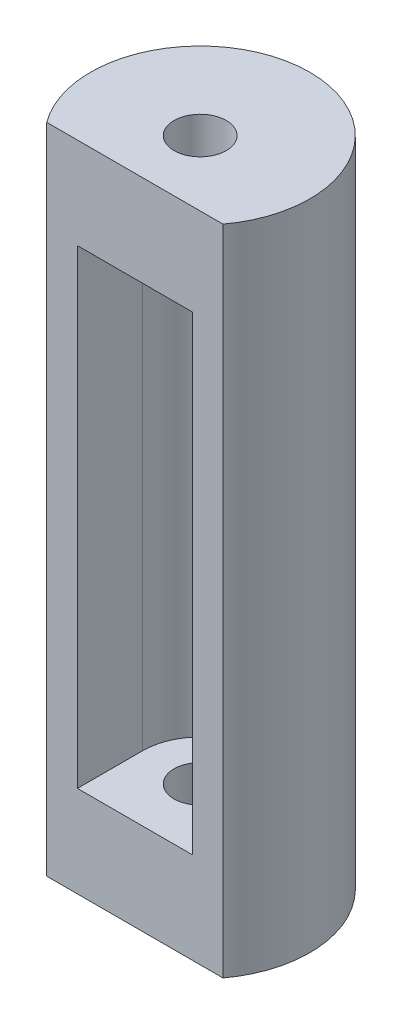
ISO-10303-21;
HEADER;
FILE_DESCRIPTION(('STEP AP214'),'2;1');
FILE_NAME('part.step','',(''),(''),'','','');
FILE_SCHEMA(('AUTOMOTIVE_DESIGN { 1 0 10303 214 1 1 1 1 }'));
ENDSEC;
DATA;
#1=APPLICATION_CONTEXT('core data for automotive mechanical design processes');
#2=APPLICATION_PROTOCOL_DEFINITION('international standard','automotive_design',2000,#1);
#3=PRODUCT_CONTEXT('',#1,'mechanical');
#4=PRODUCT('Part','Part','',(#3));
#5=PRODUCT_RELATED_PRODUCT_CATEGORY('part','',(#4));
#6=PRODUCT_DEFINITION_FORMATION('','',#4);
#7=PRODUCT_DEFINITION_CONTEXT('part definition',#1,'design');
#8=PRODUCT_DEFINITION('design','',#6,#7);
#9=PRODUCT_DEFINITION_SHAPE('','',#8);
#10=(LENGTH_UNIT() NAMED_UNIT(*) SI_UNIT(.MILLI.,.METRE.));
#11=(NAMED_UNIT(*) PLANE_ANGLE_UNIT() SI_UNIT($,.RADIAN.));
#12=(NAMED_UNIT(*) SI_UNIT($,.STERADIAN.) SOLID_ANGLE_UNIT());
#13=UNCERTAINTY_MEASURE_WITH_UNIT(LENGTH_MEASURE(1.E-05),#10,'distance_accuracy_value','');
#14=(GEOMETRIC_REPRESENTATION_CONTEXT(3) GLOBAL_UNCERTAINTY_ASSIGNED_CONTEXT((#13)) GLOBAL_UNIT_ASSIGNED_CONTEXT((#10,
#11,#12)) REPRESENTATION_CONTEXT('',''));
#15=CARTESIAN_POINT('',(0.,0.,0.));
#16=DIRECTION('',(0.,0.,1.));
#17=DIRECTION('',(1.,0.,0.));
#18=AXIS2_PLACEMENT_3D('',#15,#16,#17);
#19=CARTESIAN_POINT('',(0.,7.,0.));
#20=DIRECTION('',(0.,1.,0.));
#21=DIRECTION('',(0.,0.,1.));
#22=AXIS2_PLACEMENT_3D('',#19,#20,#21);
#23=PLANE('',#22);
#24=DIRECTION('',(0.,0.,-1.));
#25=VECTOR('',#24,1.);
#26=CARTESIAN_POINT('',(-4.4,7.,0.));
#27=LINE('',#26,#25);
#28=CARTESIAN_POINT('',(-4.4,7.,5.));
#29=VERTEX_POINT('',#28);
#30=CARTESIAN_POINT('',(-4.4,7.,0.));
#31=VERTEX_POINT('',#30);
#32=EDGE_CURVE('E124',#29,#31,#27,.T.);
#33=ORIENTED_EDGE('',*,*,#32,.F.);
#34=DIRECTION('',(1.,0.,0.));
#35=VECTOR('',#34,1.);
#36=CARTESIAN_POINT('',(6.74981481227448,7.,5.));
#37=LINE('',#36,#35);
#38=CARTESIAN_POINT('',(4.4,7.,5.));
#39=VERTEX_POINT('',#38);
#40=EDGE_CURVE('E161',#29,#39,#37,.T.);
#41=ORIENTED_EDGE('',*,*,#40,.T.);
#42=DIRECTION('',(0.,0.,1.));
#43=VECTOR('',#42,1.);
#44=CARTESIAN_POINT('',(4.4,7.,0.));
#45=LINE('',#44,#43);
#46=CARTESIAN_POINT('',(4.4,7.,0.));
#47=VERTEX_POINT('',#46);
#48=EDGE_CURVE('E60',#47,#39,#45,.T.);
#49=ORIENTED_EDGE('',*,*,#48,.F.);
#50=CARTESIAN_POINT('',(0.,7.,0.));
#51=DIRECTION('',(0.,-1.,0.));
#52=DIRECTION('',(0.,0.,1.));
#53=AXIS2_PLACEMENT_3D('',#50,#51,#52);
#54=CIRCLE('',#53,4.4);
#55=EDGE_CURVE('E55',#31,#47,#54,.T.);
#56=ORIENTED_EDGE('',*,*,#55,.F.);
#57=EDGE_LOOP('',(#33,#41,#49,#56));
#58=FACE_BOUND('',#57,.T.);
#59=CARTESIAN_POINT('',(0.,7.,0.));
#60=DIRECTION('',(0.,1.,0.));
#61=DIRECTION('',(0.,0.,1.));
#62=AXIS2_PLACEMENT_3D('',#59,#60,#61);
#63=CIRCLE('',#62,2.);
#64=CARTESIAN_POINT('',(0.,7.,2.));
#65=VERTEX_POINT('',#64);
#66=EDGE_CURVE('E154',#65,#65,#63,.T.);
#67=ORIENTED_EDGE('',*,*,#66,.F.);
#68=EDGE_LOOP('',(#67));
#69=FACE_BOUND('',#68,.T.);
#70=ADVANCED_FACE('F39',(#58,#69),#23,.T.);
#71=CARTESIAN_POINT('',(0.,0.,0.));
#72=DIRECTION('',(0.,1.,0.));
#73=DIRECTION('',(0.,0.,1.));
#74=AXIS2_PLACEMENT_3D('',#71,#72,#73);
#75=PLANE('',#74);
#76=CARTESIAN_POINT('',(0.,0.,0.));
#77=DIRECTION('',(0.,1.,0.));
#78=DIRECTION('',(0.,0.,1.));
#79=AXIS2_PLACEMENT_3D('',#76,#77,#78);
#80=CIRCLE('',#79,8.4);
#81=CARTESIAN_POINT('',(6.74981481227448,0.,5.));
#82=VERTEX_POINT('',#81);
#83=CARTESIAN_POINT('',(-6.74981481227448,0.,5.));
#84=VERTEX_POINT('',#83);
#85=EDGE_CURVE('E97',#82,#84,#80,.T.);
#86=ORIENTED_EDGE('',*,*,#85,.F.);
#87=DIRECTION('',(1.,0.,0.));
#88=VECTOR('',#87,1.);
#89=CARTESIAN_POINT('',(6.74981481227448,0.,5.));
#90=LINE('',#89,#88);
#91=EDGE_CURVE('E164',#84,#82,#90,.T.);
#92=ORIENTED_EDGE('',*,*,#91,.F.);
#93=EDGE_LOOP('',(#86,#92));
#94=FACE_BOUND('',#93,.T.);
#95=CARTESIAN_POINT('',(0.,0.,0.));
#96=DIRECTION('',(0.,1.,0.));
#97=DIRECTION('',(0.,0.,1.));
#98=AXIS2_PLACEMENT_3D('',#95,#96,#97);
#99=CIRCLE('',#98,2.);
#100=CARTESIAN_POINT('',(0.,0.,2.));
#101=VERTEX_POINT('',#100);
#102=EDGE_CURVE('E153',#101,#101,#99,.T.);
#103=ORIENTED_EDGE('',*,*,#102,.T.);
#104=EDGE_LOOP('',(#103));
#105=FACE_BOUND('',#104,.T.);
#106=ADVANCED_FACE('F170',(#94,#105),#75,.F.);
#107=CARTESIAN_POINT('',(0.,7.,0.));
#108=DIRECTION('',(0.,-1.,0.));
#109=DIRECTION('',(0.,0.,-1.));
#110=AXIS2_PLACEMENT_3D('',#107,#108,#109);
#111=CYLINDRICAL_SURFACE('',#110,8.4);
#112=ORIENTED_EDGE('',*,*,#85,.T.);
#113=DIRECTION('',(0.,-1.,0.));
#114=VECTOR('',#113,1.);
#115=CARTESIAN_POINT('',(-6.74981481227448,7.,5.));
#116=LINE('',#115,#114);
#117=CARTESIAN_POINT('',(-6.74981481227449,50.,4.99999999999999));
#118=VERTEX_POINT('',#117);
#119=EDGE_CURVE('E11',#118,#84,#116,.T.);
#120=ORIENTED_EDGE('',*,*,#119,.F.);
#121=CARTESIAN_POINT('',(0.,50.,0.));
#122=DIRECTION('',(0.,1.,0.));
#123=DIRECTION('',(0.,0.,1.));
#124=AXIS2_PLACEMENT_3D('',#121,#122,#123);
#125=CIRCLE('',#124,8.4);
#126=CARTESIAN_POINT('',(6.74981481227448,50.,5.));
#127=VERTEX_POINT('',#126);
#128=EDGE_CURVE('E95',#127,#118,#125,.T.);
#129=ORIENTED_EDGE('',*,*,#128,.F.);
#130=DIRECTION('',(0.,-1.,0.));
#131=VECTOR('',#130,1.);
#132=CARTESIAN_POINT('',(6.74981481227448,7.,5.));
#133=LINE('',#132,#131);
#134=EDGE_CURVE('E48',#127,#82,#133,.T.);
#135=ORIENTED_EDGE('',*,*,#134,.T.);
#136=EDGE_LOOP('',(#112,#120,#129,#135));
#137=FACE_BOUND('',#136,.T.);
#138=ADVANCED_FACE('F41',(#137),#111,.T.);
#139=CARTESIAN_POINT('',(6.74981481227448,7.,5.));
#140=DIRECTION('',(0.,0.,-1.));
#141=DIRECTION('',(-1.,0.,0.));
#142=AXIS2_PLACEMENT_3D('',#139,#140,#141);
#143=PLANE('',#142);
#144=ORIENTED_EDGE('',*,*,#134,.F.);
#145=DIRECTION('',(1.,0.,0.));
#146=VECTOR('',#145,1.);
#147=CARTESIAN_POINT('',(6.74981481227448,50.,5.));
#148=LINE('',#147,#146);
#149=EDGE_CURVE('E100',#118,#127,#148,.T.);
#150=ORIENTED_EDGE('',*,*,#149,.F.);
#151=ORIENTED_EDGE('',*,*,#119,.T.);
#152=ORIENTED_EDGE('',*,*,#91,.T.);
#153=EDGE_LOOP('',(#144,#150,#151,#152));
#154=FACE_BOUND('',#153,.T.);
#155=DIRECTION('',(1.,0.,0.));
#156=VECTOR('',#155,1.);
#157=CARTESIAN_POINT('',(6.74981481227448,43.,5.));
#158=LINE('',#157,#156);
#159=CARTESIAN_POINT('',(-4.4,43.,5.));
#160=VERTEX_POINT('',#159);
#161=CARTESIAN_POINT('',(4.4,43.,5.));
#162=VERTEX_POINT('',#161);
#163=EDGE_CURVE('E109',#160,#162,#158,.T.);
#164=ORIENTED_EDGE('',*,*,#163,.T.);
#165=DIRECTION('',(0.,-1.,0.));
#166=VECTOR('',#165,1.);
#167=CARTESIAN_POINT('',(4.4,43.,5.));
#168=LINE('',#167,#166);
#169=EDGE_CURVE('E146',#162,#39,#168,.T.);
#170=ORIENTED_EDGE('',*,*,#169,.T.);
#171=ORIENTED_EDGE('',*,*,#40,.F.);
#172=DIRECTION('',(0.,-1.,0.));
#173=VECTOR('',#172,1.);
#174=CARTESIAN_POINT('',(-4.4,43.,5.));
#175=LINE('',#174,#173);
#176=EDGE_CURVE('E142',#160,#29,#175,.T.);
#177=ORIENTED_EDGE('',*,*,#176,.F.);
#178=EDGE_LOOP('',(#164,#170,#171,#177));
#179=FACE_BOUND('',#178,.T.);
#180=ADVANCED_FACE('F101',(#154,#179),#143,.F.);
#181=CARTESIAN_POINT('',(0.,7.,0.));
#182=DIRECTION('',(0.,-1.,0.));
#183=DIRECTION('',(0.,0.,-1.));
#184=AXIS2_PLACEMENT_3D('',#181,#182,#183);
#185=CYLINDRICAL_SURFACE('',#184,2.);
#186=ORIENTED_EDGE('',*,*,#66,.T.);
#187=EDGE_LOOP('',(#186));
#188=FACE_BOUND('',#187,.T.);
#189=ORIENTED_EDGE('',*,*,#102,.F.);
#190=EDGE_LOOP('',(#189));
#191=FACE_BOUND('',#190,.T.);
#192=ADVANCED_FACE('F176',(#188,#191),#185,.F.);
#193=CARTESIAN_POINT('',(0.,43.,0.));
#194=DIRECTION('',(0.,-1.,0.));
#195=DIRECTION('',(0.,0.,-1.));
#196=AXIS2_PLACEMENT_3D('',#193,#194,#195);
#197=CYLINDRICAL_SURFACE('',#196,4.4);
#198=ORIENTED_EDGE('',*,*,#55,.T.);
#199=DIRECTION('',(0.,-1.,0.));
#200=VECTOR('',#199,1.);
#201=CARTESIAN_POINT('',(4.4,43.,0.));
#202=LINE('',#201,#200);
#203=CARTESIAN_POINT('',(4.4,43.,0.));
#204=VERTEX_POINT('',#203);
#205=EDGE_CURVE('E150',#204,#47,#202,.T.);
#206=ORIENTED_EDGE('',*,*,#205,.F.);
#207=CARTESIAN_POINT('',(0.,43.,0.));
#208=DIRECTION('',(0.,-1.,0.));
#209=DIRECTION('',(0.,0.,1.));
#210=AXIS2_PLACEMENT_3D('',#207,#208,#209);
#211=CIRCLE('',#210,4.4);
#212=CARTESIAN_POINT('',(-4.4,43.,0.));
#213=VERTEX_POINT('',#212);
#214=EDGE_CURVE('E119',#213,#204,#211,.T.);
#215=ORIENTED_EDGE('',*,*,#214,.F.);
#216=DIRECTION('',(0.,-1.,0.));
#217=VECTOR('',#216,1.);
#218=CARTESIAN_POINT('',(-4.4,43.,0.));
#219=LINE('',#218,#217);
#220=EDGE_CURVE('E132',#213,#31,#219,.T.);
#221=ORIENTED_EDGE('',*,*,#220,.T.);
#222=EDGE_LOOP('',(#198,#206,#215,#221));
#223=FACE_BOUND('',#222,.T.);
#224=ADVANCED_FACE('F178',(#223),#197,.F.);
#225=CARTESIAN_POINT('',(4.4,43.,0.));
#226=DIRECTION('',(1.,0.,0.));
#227=DIRECTION('',(0.,0.,-1.));
#228=AXIS2_PLACEMENT_3D('',#225,#226,#227);
#229=PLANE('',#228);
#230=ORIENTED_EDGE('',*,*,#48,.T.);
#231=ORIENTED_EDGE('',*,*,#169,.F.);
#232=DIRECTION('',(0.,0.,1.));
#233=VECTOR('',#232,1.);
#234=CARTESIAN_POINT('',(4.4,43.,0.));
#235=LINE('',#234,#233);
#236=EDGE_CURVE('E123',#204,#162,#235,.T.);
#237=ORIENTED_EDGE('',*,*,#236,.F.);
#238=ORIENTED_EDGE('',*,*,#205,.T.);
#239=EDGE_LOOP('',(#230,#231,#237,#238));
#240=FACE_BOUND('',#239,.T.);
#241=ADVANCED_FACE('F185',(#240),#229,.F.);
#242=CARTESIAN_POINT('',(-4.4,43.,0.));
#243=DIRECTION('',(-1.,0.,0.));
#244=DIRECTION('',(0.,0.,1.));
#245=AXIS2_PLACEMENT_3D('',#242,#243,#244);
#246=PLANE('',#245);
#247=ORIENTED_EDGE('',*,*,#32,.T.);
#248=ORIENTED_EDGE('',*,*,#220,.F.);
#249=DIRECTION('',(0.,0.,-1.));
#250=VECTOR('',#249,1.);
#251=CARTESIAN_POINT('',(-4.4,43.,0.));
#252=LINE('',#251,#250);
#253=EDGE_CURVE('E128',#160,#213,#252,.T.);
#254=ORIENTED_EDGE('',*,*,#253,.F.);
#255=ORIENTED_EDGE('',*,*,#176,.T.);
#256=EDGE_LOOP('',(#247,#248,#254,#255));
#257=FACE_BOUND('',#256,.T.);
#258=ADVANCED_FACE('F198',(#257),#246,.F.);
#259=CARTESIAN_POINT('',(0.,43.,0.));
#260=DIRECTION('',(0.,1.,0.));
#261=DIRECTION('',(0.,0.,1.));
#262=AXIS2_PLACEMENT_3D('',#259,#260,#261);
#263=PLANE('',#262);
#264=CARTESIAN_POINT('',(0.,43.,0.));
#265=DIRECTION('',(0.,1.,0.));
#266=DIRECTION('',(0.,0.,1.));
#267=AXIS2_PLACEMENT_3D('',#264,#265,#266);
#268=CIRCLE('',#267,2.);
#269=CARTESIAN_POINT('',(0.,43.,2.));
#270=VERTEX_POINT('',#269);
#271=EDGE_CURVE('E116',#270,#270,#268,.T.);
#272=ORIENTED_EDGE('',*,*,#271,.T.);
#273=EDGE_LOOP('',(#272));
#274=FACE_BOUND('',#273,.T.);
#275=ORIENTED_EDGE('',*,*,#214,.T.);
#276=ORIENTED_EDGE('',*,*,#236,.T.);
#277=ORIENTED_EDGE('',*,*,#163,.F.);
#278=ORIENTED_EDGE('',*,*,#253,.T.);
#279=EDGE_LOOP('',(#275,#276,#277,#278));
#280=FACE_BOUND('',#279,.T.);
#281=ADVANCED_FACE('F201',(#274,#280),#263,.F.);
#282=CARTESIAN_POINT('',(0.,50.,0.));
#283=DIRECTION('',(0.,1.,0.));
#284=DIRECTION('',(0.,0.,1.));
#285=AXIS2_PLACEMENT_3D('',#282,#283,#284);
#286=PLANE('',#285);
#287=ORIENTED_EDGE('',*,*,#128,.T.);
#288=ORIENTED_EDGE('',*,*,#149,.T.);
#289=EDGE_LOOP('',(#287,#288));
#290=FACE_BOUND('',#289,.T.);
#291=CARTESIAN_POINT('',(0.,50.,0.));
#292=DIRECTION('',(0.,1.,0.));
#293=DIRECTION('',(0.,0.,1.));
#294=AXIS2_PLACEMENT_3D('',#291,#292,#293);
#295=CIRCLE('',#294,2.);
#296=CARTESIAN_POINT('',(0.,50.,2.));
#297=VERTEX_POINT('',#296);
#298=EDGE_CURVE('E113',#297,#297,#295,.T.);
#299=ORIENTED_EDGE('',*,*,#298,.F.);
#300=EDGE_LOOP('',(#299));
#301=FACE_BOUND('',#300,.T.);
#302=ADVANCED_FACE('F106',(#290,#301),#286,.T.);
#303=CARTESIAN_POINT('',(0.,50.,0.));
#304=DIRECTION('',(0.,-1.,0.));
#305=DIRECTION('',(0.,0.,-1.));
#306=AXIS2_PLACEMENT_3D('',#303,#304,#305);
#307=CYLINDRICAL_SURFACE('',#306,2.);
#308=ORIENTED_EDGE('',*,*,#298,.T.);
#309=EDGE_LOOP('',(#308));
#310=FACE_BOUND('',#309,.T.);
#311=ORIENTED_EDGE('',*,*,#271,.F.);
#312=EDGE_LOOP('',(#311));
#313=FACE_BOUND('',#312,.T.);
#314=ADVANCED_FACE('F216',(#310,#313),#307,.F.);
#315=CLOSED_SHELL('',(#70,#106,#138,#180,#192,#224,#241,#258,#281,#302,#314));
#316=MANIFOLD_SOLID_BREP('B2',#315);
#317=ADVANCED_BREP_SHAPE_REPRESENTATION('',(#18,#316),#14);
#318=SHAPE_DEFINITION_REPRESENTATION(#9,#317);
ENDSEC;
END-ISO-10303-21;
